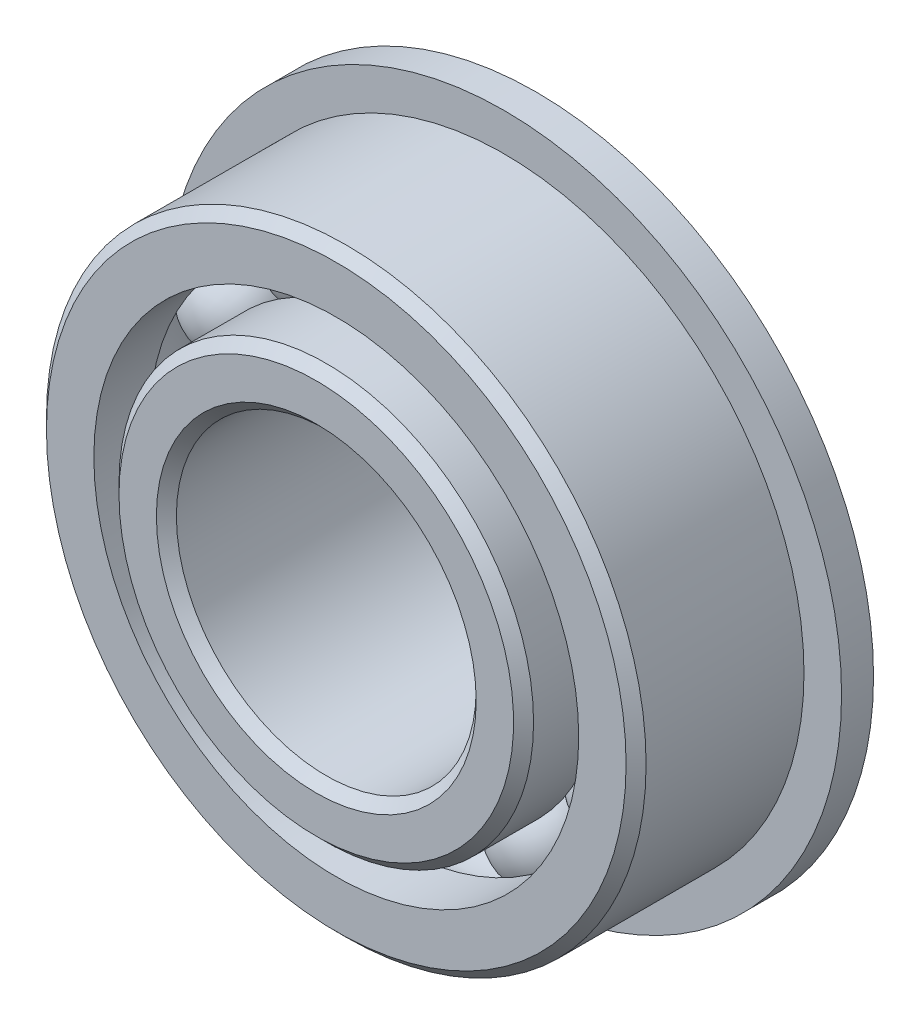
ISO-10303-21;
HEADER;
FILE_DESCRIPTION(('STEP AP214'),'2;1');
FILE_NAME('part.step','',(''),(''),'','','');
FILE_SCHEMA(('AUTOMOTIVE_DESIGN { 1 0 10303 214 1 1 1 1 }'));
ENDSEC;
DATA;
#1=APPLICATION_CONTEXT('core data for automotive mechanical design processes');
#2=APPLICATION_PROTOCOL_DEFINITION('international standard','automotive_design',2000,#1);
#3=PRODUCT_CONTEXT('',#1,'mechanical');
#4=PRODUCT('Part','Part','',(#3));
#5=PRODUCT_RELATED_PRODUCT_CATEGORY('part','',(#4));
#6=PRODUCT_DEFINITION_FORMATION('','',#4);
#7=PRODUCT_DEFINITION_CONTEXT('part definition',#1,'design');
#8=PRODUCT_DEFINITION('design','',#6,#7);
#9=PRODUCT_DEFINITION_SHAPE('','',#8);
#10=(LENGTH_UNIT() NAMED_UNIT(*) SI_UNIT(.MILLI.,.METRE.));
#11=(NAMED_UNIT(*) PLANE_ANGLE_UNIT() SI_UNIT($,.RADIAN.));
#12=(NAMED_UNIT(*) SI_UNIT($,.STERADIAN.) SOLID_ANGLE_UNIT());
#13=UNCERTAINTY_MEASURE_WITH_UNIT(LENGTH_MEASURE(1.E-05),#10,'distance_accuracy_value','');
#14=(GEOMETRIC_REPRESENTATION_CONTEXT(3) GLOBAL_UNCERTAINTY_ASSIGNED_CONTEXT((#13)) GLOBAL_UNIT_ASSIGNED_CONTEXT((#10,
#11,#12)) REPRESENTATION_CONTEXT('',''));
#15=CARTESIAN_POINT('',(0.,0.,0.));
#16=DIRECTION('',(0.,0.,1.));
#17=DIRECTION('',(1.,0.,0.));
#18=AXIS2_PLACEMENT_3D('',#15,#16,#17);
#19=CARTESIAN_POINT('',(0.,-3.571875,0.));
#20=DIRECTION('',(0.,-1.,0.));
#21=DIRECTION('',(0.,0.,-1.));
#22=AXIS2_PLACEMENT_3D('',#19,#20,#21);
#23=SPHERICAL_SURFACE('',#22,0.758760243513404);
#24=CARTESIAN_POINT('',(0.,-2.8131147564866,0.));
#25=VERTEX_POINT('',#24);
#26=VERTEX_LOOP('',#25);
#27=FACE_BOUND('',#26,.T.);
#28=CARTESIAN_POINT('',(0.,-4.33063524351341,0.));
#29=VERTEX_POINT('',#28);
#30=VERTEX_LOOP('',#29);
#31=FACE_BOUND('',#30,.T.);
#32=ADVANCED_FACE('P0_F15',(#27,#31),#23,.T.);
#33=CLOSED_SHELL('',(#32));
#34=MANIFOLD_SOLID_BREP('P0_B1',#33);
#35=CARTESIAN_POINT('',(0.,0.,0.));
#36=DIRECTION('',(0.,0.,1.));
#37=DIRECTION('',(1.,0.,0.));
#38=AXIS2_PLACEMENT_3D('',#35,#36,#37);
#39=TOROIDAL_SURFACE('',#38,3.57187499999999,0.758760243513403);
#40=CARTESIAN_POINT('',(0.,0.,0.705555555555555));
#41=DIRECTION('',(0.,0.,1.));
#42=DIRECTION('',(1.,0.,0.));
#43=AXIS2_PLACEMENT_3D('',#40,#41,#42);
#44=CIRCLE('',#43,3.29275412087912);
#45=CARTESIAN_POINT('',(3.29275412087912,0.,0.705555555555555));
#46=VERTEX_POINT('',#45);
#47=EDGE_CURVE('P1_E45',#46,#46,#44,.T.);
#48=ORIENTED_EDGE('',*,*,#47,.F.);
#49=EDGE_LOOP('',(#48));
#50=FACE_BOUND('',#49,.T.);
#51=CARTESIAN_POINT('',(0.,0.,-0.705555555555556));
#52=DIRECTION('',(0.,0.,1.));
#53=DIRECTION('',(1.,0.,0.));
#54=AXIS2_PLACEMENT_3D('',#51,#52,#53);
#55=CIRCLE('',#54,3.29275412087912);
#56=CARTESIAN_POINT('',(3.29275412087912,0.,-0.705555555555556));
#57=VERTEX_POINT('',#56);
#58=EDGE_CURVE('P1_E42',#57,#57,#55,.F.);
#59=ORIENTED_EDGE('',*,*,#58,.F.);
#60=EDGE_LOOP('',(#59));
#61=FACE_BOUND('',#60,.T.);
#62=ADVANCED_FACE('P1_F14',(#50,#61),#39,.F.);
#63=CARTESIAN_POINT('',(0.,0.,1.5875));
#64=DIRECTION('',(0.,0.,1.));
#65=DIRECTION('',(1.,0.,0.));
#66=AXIS2_PLACEMENT_3D('',#63,#64,#65);
#67=CYLINDRICAL_SURFACE('',#66,3.29275412087912);
#68=ORIENTED_EDGE('',*,*,#47,.T.);
#69=EDGE_LOOP('',(#68));
#70=FACE_BOUND('',#69,.T.);
#71=CARTESIAN_POINT('',(0.,0.,1.74624999993966));
#72=DIRECTION('',(0.,0.,-1.));
#73=DIRECTION('',(-1.,0.,0.));
#74=AXIS2_PLACEMENT_3D('',#71,#72,#73);
#75=CIRCLE('',#74,3.29275412087782);
#76=CARTESIAN_POINT('',(-3.29275412087782,0.,1.74624999993966));
#77=VERTEX_POINT('',#76);
#78=EDGE_CURVE('P1_E38',#77,#77,#75,.F.);
#79=ORIENTED_EDGE('',*,*,#78,.F.);
#80=EDGE_LOOP('',(#79));
#81=FACE_BOUND('',#80,.T.);
#82=ADVANCED_FACE('P1_F79',(#70,#81),#67,.T.);
#83=CARTESIAN_POINT('',(0.,0.,1.5875));
#84=DIRECTION('',(0.,0.,1.));
#85=DIRECTION('',(1.,0.,0.));
#86=AXIS2_PLACEMENT_3D('',#83,#84,#85);
#87=CYLINDRICAL_SURFACE('',#86,3.29275412087912);
#88=ORIENTED_EDGE('',*,*,#58,.T.);
#89=EDGE_LOOP('',(#88));
#90=FACE_BOUND('',#89,.T.);
#91=CARTESIAN_POINT('',(0.,0.,-1.74624999999651));
#92=DIRECTION('',(0.,0.,1.));
#93=DIRECTION('',(1.,0.,0.));
#94=AXIS2_PLACEMENT_3D('',#91,#92,#93);
#95=CIRCLE('',#94,3.29275412082097);
#96=CARTESIAN_POINT('',(3.29275412082097,0.,-1.74624999999651));
#97=VERTEX_POINT('',#96);
#98=EDGE_CURVE('P1_E34',#97,#97,#95,.F.);
#99=ORIENTED_EDGE('',*,*,#98,.F.);
#100=EDGE_LOOP('',(#99));
#101=FACE_BOUND('',#100,.T.);
#102=ADVANCED_FACE('P1_F75',(#90,#101),#87,.T.);
#103=CARTESIAN_POINT('',(0.,0.,1.74624999993966));
#104=DIRECTION('',(0.,0.,-1.));
#105=DIRECTION('',(-1.,0.,0.));
#106=AXIS2_PLACEMENT_3D('',#103,#104,#105);
#107=CONICAL_SURFACE('',#106,3.29275412087782,0.785398163397448);
#108=CARTESIAN_POINT('',(0.,0.,1.90500000002203));
#109=DIRECTION('',(0.,0.,-1.));
#110=DIRECTION('',(-1.,0.,0.));
#111=AXIS2_PLACEMENT_3D('',#108,#109,#110);
#112=CIRCLE('',#111,3.13400412079545);
#113=CARTESIAN_POINT('',(-3.13400412079545,0.,1.90500000002203));
#114=VERTEX_POINT('',#113);
#115=EDGE_CURVE('P1_E18',#114,#114,#112,.F.);
#116=ORIENTED_EDGE('',*,*,#115,.F.);
#117=EDGE_LOOP('',(#116));
#118=FACE_BOUND('',#117,.T.);
#119=ORIENTED_EDGE('',*,*,#78,.T.);
#120=EDGE_LOOP('',(#119));
#121=FACE_BOUND('',#120,.T.);
#122=ADVANCED_FACE('P1_F71',(#118,#121),#107,.T.);
#123=CARTESIAN_POINT('',(0.,0.,-1.74625000011019));
#124=DIRECTION('',(0.,0.,1.));
#125=DIRECTION('',(1.,0.,0.));
#126=AXIS2_PLACEMENT_3D('',#123,#124,#125);
#127=CONICAL_SURFACE('',#126,3.29275412076413,0.785398163397448);
#128=ORIENTED_EDGE('',*,*,#98,.T.);
#129=EDGE_LOOP('',(#128));
#130=FACE_BOUND('',#129,.T.);
#131=CARTESIAN_POINT('',(0.,0.,-1.90500000002203));
#132=DIRECTION('',(0.,0.,1.));
#133=DIRECTION('',(1.,0.,0.));
#134=AXIS2_PLACEMENT_3D('',#131,#132,#133);
#135=CIRCLE('',#134,3.1340041208523);
#136=CARTESIAN_POINT('',(3.1340041208523,0.,-1.90500000002203));
#137=VERTEX_POINT('',#136);
#138=EDGE_CURVE('P1_E56',#137,#137,#135,.F.);
#139=ORIENTED_EDGE('',*,*,#138,.F.);
#140=EDGE_LOOP('',(#139));
#141=FACE_BOUND('',#140,.T.);
#142=ADVANCED_FACE('P1_F74',(#130,#141),#127,.T.);
#143=CARTESIAN_POINT('',(0.,2.54,1.905));
#144=DIRECTION('',(0.,0.,1.));
#145=DIRECTION('',(1.,0.,0.));
#146=AXIS2_PLACEMENT_3D('',#143,#144,#145);
#147=PLANE('',#146);
#148=ORIENTED_EDGE('',*,*,#115,.T.);
#149=EDGE_LOOP('',(#148));
#150=FACE_BOUND('',#149,.T.);
#151=CARTESIAN_POINT('',(0.,0.,1.90500000002203));
#152=DIRECTION('',(0.,0.,1.));
#153=DIRECTION('',(1.,0.,0.));
#154=AXIS2_PLACEMENT_3D('',#151,#152,#153);
#155=CIRCLE('',#154,2.53999999995358);
#156=CARTESIAN_POINT('',(2.53999999995358,0.,1.90500000002203));
#157=VERTEX_POINT('',#156);
#158=EDGE_CURVE('P1_E54',#157,#157,#155,.F.);
#159=ORIENTED_EDGE('',*,*,#158,.T.);
#160=EDGE_LOOP('',(#159));
#161=FACE_BOUND('',#160,.T.);
#162=ADVANCED_FACE('P1_F68',(#150,#161),#147,.T.);
#163=CARTESIAN_POINT('',(0.,2.54,-1.905));
#164=DIRECTION('',(0.,0.,-1.));
#165=DIRECTION('',(-1.,0.,0.));
#166=AXIS2_PLACEMENT_3D('',#163,#164,#165);
#167=PLANE('',#166);
#168=CARTESIAN_POINT('',(0.,0.,-1.90500000002203));
#169=DIRECTION('',(0.,0.,-1.));
#170=DIRECTION('',(0.,1.,0.));
#171=AXIS2_PLACEMENT_3D('',#168,#169,#170);
#172=CIRCLE('',#171,2.53999999995358);
#173=CARTESIAN_POINT('',(0.,2.53999999995358,-1.90500000002203));
#174=VERTEX_POINT('',#173);
#175=EDGE_CURVE('P1_E31',#174,#174,#172,.F.);
#176=ORIENTED_EDGE('',*,*,#175,.T.);
#177=EDGE_LOOP('',(#176));
#178=FACE_BOUND('',#177,.T.);
#179=ORIENTED_EDGE('',*,*,#138,.T.);
#180=EDGE_LOOP('',(#179));
#181=FACE_BOUND('',#180,.T.);
#182=ADVANCED_FACE('P1_F103',(#178,#181),#167,.T.);
#183=CARTESIAN_POINT('',(0.,0.,1.90499999990834));
#184=DIRECTION('',(0.,0.,1.));
#185=DIRECTION('',(1.,0.,0.));
#186=AXIS2_PLACEMENT_3D('',#183,#184,#185);
#187=CONICAL_SURFACE('',#186,2.53999999983989,0.785398163397448);
#188=ORIENTED_EDGE('',*,*,#158,.F.);
#189=EDGE_LOOP('',(#188));
#190=FACE_BOUND('',#189,.T.);
#191=CARTESIAN_POINT('',(0.,0.,1.74625));
#192=DIRECTION('',(0.,0.,1.));
#193=DIRECTION('',(1.,0.,0.));
#194=AXIS2_PLACEMENT_3D('',#191,#192,#193);
#195=CIRCLE('',#194,2.38125);
#196=CARTESIAN_POINT('',(2.38125,0.,1.74625));
#197=VERTEX_POINT('',#196);
#198=EDGE_CURVE('P1_E23',#197,#197,#195,.F.);
#199=ORIENTED_EDGE('',*,*,#198,.T.);
#200=EDGE_LOOP('',(#199));
#201=FACE_BOUND('',#200,.T.);
#202=ADVANCED_FACE('P1_F96',(#190,#201),#187,.F.);
#203=CARTESIAN_POINT('',(0.,0.,-1.90500000002203));
#204=DIRECTION('',(0.,0.,-1.));
#205=DIRECTION('',(0.,1.,0.));
#206=AXIS2_PLACEMENT_3D('',#203,#204,#205);
#207=CONICAL_SURFACE('',#206,2.53999999995358,0.785398163397448);
#208=CARTESIAN_POINT('',(0.,0.,-1.74625));
#209=DIRECTION('',(0.,0.,1.));
#210=DIRECTION('',(1.,0.,0.));
#211=AXIS2_PLACEMENT_3D('',#208,#209,#210);
#212=CIRCLE('',#211,2.38125);
#213=CARTESIAN_POINT('',(2.38125,0.,-1.74625));
#214=VERTEX_POINT('',#213);
#215=EDGE_CURVE('P1_E10',#214,#214,#212,.T.);
#216=ORIENTED_EDGE('',*,*,#215,.T.);
#217=EDGE_LOOP('',(#216));
#218=FACE_BOUND('',#217,.T.);
#219=ORIENTED_EDGE('',*,*,#175,.F.);
#220=EDGE_LOOP('',(#219));
#221=FACE_BOUND('',#220,.T.);
#222=ADVANCED_FACE('P1_F91',(#218,#221),#207,.F.);
#223=CARTESIAN_POINT('',(0.,0.,1.5875));
#224=DIRECTION('',(0.,0.,1.));
#225=DIRECTION('',(1.,0.,0.));
#226=AXIS2_PLACEMENT_3D('',#223,#224,#225);
#227=CYLINDRICAL_SURFACE('',#226,2.38125);
#228=ORIENTED_EDGE('',*,*,#198,.F.);
#229=EDGE_LOOP('',(#228));
#230=FACE_BOUND('',#229,.T.);
#231=ORIENTED_EDGE('',*,*,#215,.F.);
#232=EDGE_LOOP('',(#231));
#233=FACE_BOUND('',#232,.T.);
#234=ADVANCED_FACE('P1_F90',(#230,#233),#227,.F.);
#235=CLOSED_SHELL('',(#62,#82,#102,#122,#142,#162,#182,#202,#222,#234));
#236=MANIFOLD_SOLID_BREP('P1_B1',#235);
#237=CARTESIAN_POINT('',(1.78593749999998,-3.09333448914255,0.));
#238=DIRECTION('',(0.499999999999995,-0.866025403784442,0.));
#239=DIRECTION('',(0.,0.,-1.));
#240=AXIS2_PLACEMENT_3D('',#237,#238,#239);
#241=SPHERICAL_SURFACE('',#240,0.758760243513404);
#242=CARTESIAN_POINT('',(1.40655737824328,-2.43622884287828,0.));
#243=VERTEX_POINT('',#242);
#244=VERTEX_LOOP('',#243);
#245=FACE_BOUND('',#244,.T.);
#246=CARTESIAN_POINT('',(2.16531762175668,-3.75044013540683,0.));
#247=VERTEX_POINT('',#246);
#248=VERTEX_LOOP('',#247);
#249=FACE_BOUND('',#248,.T.);
#250=ADVANCED_FACE('P2_F15',(#245,#249),#241,.T.);
#251=CLOSED_SHELL('',(#250));
#252=MANIFOLD_SOLID_BREP('P2_B1',#251);
#253=CARTESIAN_POINT('',(1.7859375,3.09333448914254,0.));
#254=DIRECTION('',(0.500000000000001,0.866025403784438,0.));
#255=DIRECTION('',(0.,0.,-1.));
#256=AXIS2_PLACEMENT_3D('',#253,#254,#255);
#257=SPHERICAL_SURFACE('',#256,0.758760243513404);
#258=CARTESIAN_POINT('',(1.4065573782433,2.43622884287827,0.));
#259=VERTEX_POINT('',#258);
#260=VERTEX_LOOP('',#259);
#261=FACE_BOUND('',#260,.T.);
#262=CARTESIAN_POINT('',(2.16531762175671,3.75044013540681,0.));
#263=VERTEX_POINT('',#262);
#264=VERTEX_LOOP('',#263);
#265=FACE_BOUND('',#264,.T.);
#266=ADVANCED_FACE('P3_F15',(#261,#265),#257,.T.);
#267=CLOSED_SHELL('',(#266));
#268=MANIFOLD_SOLID_BREP('P3_B1',#267);
#269=CARTESIAN_POINT('',(3.09333448914253,-1.78593750000002,0.));
#270=DIRECTION('',(0.866025403784436,-0.500000000000004,0.));
#271=DIRECTION('',(0.,0.,-1.));
#272=AXIS2_PLACEMENT_3D('',#269,#270,#271);
#273=SPHERICAL_SURFACE('',#272,0.758760243513404);
#274=CARTESIAN_POINT('',(2.43622884287826,-1.40655737824331,0.));
#275=VERTEX_POINT('',#274);
#276=VERTEX_LOOP('',#275);
#277=FACE_BOUND('',#276,.T.);
#278=CARTESIAN_POINT('',(3.75044013540681,-2.16531762175672,0.));
#279=VERTEX_POINT('',#278);
#280=VERTEX_LOOP('',#279);
#281=FACE_BOUND('',#280,.T.);
#282=ADVANCED_FACE('P4_F15',(#277,#281),#273,.T.);
#283=CLOSED_SHELL('',(#282));
#284=MANIFOLD_SOLID_BREP('P4_B1',#283);
#285=CARTESIAN_POINT('',(3.571875,0.,0.));
#286=DIRECTION('',(1.,0.,0.));
#287=DIRECTION('',(0.,0.,-1.));
#288=AXIS2_PLACEMENT_3D('',#285,#286,#287);
#289=SPHERICAL_SURFACE('',#288,0.758760243513404);
#290=CARTESIAN_POINT('',(4.33063524351341,0.,0.));
#291=VERTEX_POINT('',#290);
#292=VERTEX_LOOP('',#291);
#293=FACE_BOUND('',#292,.T.);
#294=CARTESIAN_POINT('',(2.8131147564866,0.,0.));
#295=VERTEX_POINT('',#294);
#296=VERTEX_LOOP('',#295);
#297=FACE_BOUND('',#296,.T.);
#298=ADVANCED_FACE('P5_F15',(#293,#297),#289,.T.);
#299=CLOSED_SHELL('',(#298));
#300=MANIFOLD_SOLID_BREP('P5_B1',#299);
#301=CARTESIAN_POINT('',(0.,3.571875,0.));
#302=DIRECTION('',(0.,1.,0.));
#303=DIRECTION('',(0.,0.,-1.));
#304=AXIS2_PLACEMENT_3D('',#301,#302,#303);
#305=SPHERICAL_SURFACE('',#304,0.758760243513404);
#306=CARTESIAN_POINT('',(0.,2.8131147564866,0.));
#307=VERTEX_POINT('',#306);
#308=VERTEX_LOOP('',#307);
#309=FACE_BOUND('',#308,.T.);
#310=CARTESIAN_POINT('',(0.,4.33063524351341,0.));
#311=VERTEX_POINT('',#310);
#312=VERTEX_LOOP('',#311);
#313=FACE_BOUND('',#312,.T.);
#314=ADVANCED_FACE('P6_F15',(#309,#313),#305,.T.);
#315=CLOSED_SHELL('',(#314));
#316=MANIFOLD_SOLID_BREP('P6_B1',#315);
#317=CARTESIAN_POINT('',(3.09333448914255,1.78593749999999,0.));
#318=DIRECTION('',(0.86602540378444,0.499999999999998,0.));
#319=DIRECTION('',(0.,0.,-1.));
#320=AXIS2_PLACEMENT_3D('',#317,#318,#319);
#321=SPHERICAL_SURFACE('',#320,0.758760243513404);
#322=CARTESIAN_POINT('',(3.75044013540682,2.16531762175669,0.));
#323=VERTEX_POINT('',#322);
#324=VERTEX_LOOP('',#323);
#325=FACE_BOUND('',#324,.T.);
#326=CARTESIAN_POINT('',(2.43622884287827,1.40655737824329,0.));
#327=VERTEX_POINT('',#326);
#328=VERTEX_LOOP('',#327);
#329=FACE_BOUND('',#328,.T.);
#330=ADVANCED_FACE('P7_F15',(#325,#329),#321,.T.);
#331=CLOSED_SHELL('',(#330));
#332=MANIFOLD_SOLID_BREP('P7_B1',#331);
#333=CARTESIAN_POINT('',(-3.571875,0.,0.));
#334=DIRECTION('',(-1.,0.,0.));
#335=DIRECTION('',(0.,0.,-1.));
#336=AXIS2_PLACEMENT_3D('',#333,#334,#335);
#337=SPHERICAL_SURFACE('',#336,0.758760243513404);
#338=CARTESIAN_POINT('',(-4.33063524351341,0.,0.));
#339=VERTEX_POINT('',#338);
#340=VERTEX_LOOP('',#339);
#341=FACE_BOUND('',#340,.T.);
#342=CARTESIAN_POINT('',(-2.8131147564866,0.,0.));
#343=VERTEX_POINT('',#342);
#344=VERTEX_LOOP('',#343);
#345=FACE_BOUND('',#344,.T.);
#346=ADVANCED_FACE('P8_F15',(#341,#345),#337,.T.);
#347=CLOSED_SHELL('',(#346));
#348=MANIFOLD_SOLID_BREP('P8_B1',#347);
#349=CARTESIAN_POINT('',(-3.09333448914256,-1.78593749999997,0.));
#350=DIRECTION('',(-0.866025403784443,-0.499999999999992,0.));
#351=DIRECTION('',(0.,0.,-1.));
#352=AXIS2_PLACEMENT_3D('',#349,#350,#351);
#353=SPHERICAL_SURFACE('',#352,0.758760243513404);
#354=CARTESIAN_POINT('',(-3.75044013540684,-2.16531762175667,0.));
#355=VERTEX_POINT('',#354);
#356=VERTEX_LOOP('',#355);
#357=FACE_BOUND('',#356,.T.);
#358=CARTESIAN_POINT('',(-2.43622884287828,-1.40655737824328,0.));
#359=VERTEX_POINT('',#358);
#360=VERTEX_LOOP('',#359);
#361=FACE_BOUND('',#360,.T.);
#362=ADVANCED_FACE('P9_F15',(#357,#361),#353,.T.);
#363=CLOSED_SHELL('',(#362));
#364=MANIFOLD_SOLID_BREP('P9_B1',#363);
#365=CARTESIAN_POINT('',(-3.09333448914252,1.78593750000004,0.));
#366=DIRECTION('',(-0.866025403784433,0.50000000000001,0.));
#367=DIRECTION('',(0.,0.,-1.));
#368=AXIS2_PLACEMENT_3D('',#365,#366,#367);
#369=SPHERICAL_SURFACE('',#368,0.758760243513404);
#370=CARTESIAN_POINT('',(-2.43622884287825,1.40655737824333,0.));
#371=VERTEX_POINT('',#370);
#372=VERTEX_LOOP('',#371);
#373=FACE_BOUND('',#372,.T.);
#374=CARTESIAN_POINT('',(-3.75044013540679,2.16531762175675,0.));
#375=VERTEX_POINT('',#374);
#376=VERTEX_LOOP('',#375);
#377=FACE_BOUND('',#376,.T.);
#378=ADVANCED_FACE('P10_F15',(#373,#377),#369,.T.);
#379=CLOSED_SHELL('',(#378));
#380=MANIFOLD_SOLID_BREP('P10_B1',#379);
#381=CARTESIAN_POINT('',(-1.78593749999996,3.09333448914257,0.));
#382=DIRECTION('',(-0.499999999999989,0.866025403784445,0.));
#383=DIRECTION('',(0.,0.,-1.));
#384=AXIS2_PLACEMENT_3D('',#381,#382,#383);
#385=SPHERICAL_SURFACE('',#384,0.758760243513404);
#386=CARTESIAN_POINT('',(-2.16531762175665,3.75044013540685,0.));
#387=VERTEX_POINT('',#386);
#388=VERTEX_LOOP('',#387);
#389=FACE_BOUND('',#388,.T.);
#390=CARTESIAN_POINT('',(-1.40655737824327,2.43622884287829,0.));
#391=VERTEX_POINT('',#390);
#392=VERTEX_LOOP('',#391);
#393=FACE_BOUND('',#392,.T.);
#394=ADVANCED_FACE('P11_F15',(#389,#393),#385,.T.);
#395=CLOSED_SHELL('',(#394));
#396=MANIFOLD_SOLID_BREP('P11_B1',#395);
#397=CARTESIAN_POINT('',(0.,4.60375,1.5875));
#398=DIRECTION('',(0.,0.,-1.));
#399=DIRECTION('',(-1.,0.,0.));
#400=AXIS2_PLACEMENT_3D('',#397,#398,#399);
#401=PLANE('',#400);
#402=CARTESIAN_POINT('',(0.,0.,1.58750000002783));
#403=DIRECTION('',(0.,0.,-1.));
#404=DIRECTION('',(-1.,0.,0.));
#405=AXIS2_PLACEMENT_3D('',#402,#403,#404);
#406=CIRCLE('',#405,4.60374999994428);
#407=CARTESIAN_POINT('',(-4.60374999994428,0.,1.58750000002783));
#408=VERTEX_POINT('',#407);
#409=EDGE_CURVE('P12_E25',#408,#408,#406,.T.);
#410=ORIENTED_EDGE('',*,*,#409,.F.);
#411=EDGE_LOOP('',(#410));
#412=FACE_BOUND('',#411,.T.);
#413=CARTESIAN_POINT('',(0.,0.,1.5875));
#414=DIRECTION('',(0.,0.,1.));
#415=DIRECTION('',(1.,0.,0.));
#416=AXIS2_PLACEMENT_3D('',#413,#414,#415);
#417=CIRCLE('',#416,3.85099587912088);
#418=CARTESIAN_POINT('',(3.85099587912088,0.,1.5875));
#419=VERTEX_POINT('',#418);
#420=EDGE_CURVE('P12_E52',#419,#419,#417,.F.);
#421=ORIENTED_EDGE('',*,*,#420,.T.);
#422=EDGE_LOOP('',(#421));
#423=FACE_BOUND('',#422,.T.);
#424=ADVANCED_FACE('P12_F22',(#412,#423),#401,.F.);
#425=CARTESIAN_POINT('',(0.,0.,1.42874999994547));
#426=DIRECTION('',(0.,0.,-1.));
#427=DIRECTION('',(-1.,0.,0.));
#428=AXIS2_PLACEMENT_3D('',#425,#426,#427);
#429=CONICAL_SURFACE('',#428,4.76250000002665,0.785398163397448);
#430=ORIENTED_EDGE('',*,*,#409,.T.);
#431=EDGE_LOOP('',(#430));
#432=FACE_BOUND('',#431,.T.);
#433=CARTESIAN_POINT('',(0.,0.,1.42875));
#434=DIRECTION('',(0.,0.,1.));
#435=DIRECTION('',(1.,0.,0.));
#436=AXIS2_PLACEMENT_3D('',#433,#434,#435);
#437=CIRCLE('',#436,4.7625);
#438=CARTESIAN_POINT('',(4.7625,0.,1.42875));
#439=VERTEX_POINT('',#438);
#440=EDGE_CURVE('P12_E42',#439,#439,#437,.F.);
#441=ORIENTED_EDGE('',*,*,#440,.F.);
#442=EDGE_LOOP('',(#441));
#443=FACE_BOUND('',#442,.T.);
#444=ADVANCED_FACE('P12_F69',(#432,#443),#429,.T.);
#445=CARTESIAN_POINT('',(0.,0.,1.5875));
#446=DIRECTION('',(0.,0.,1.));
#447=DIRECTION('',(1.,0.,0.));
#448=AXIS2_PLACEMENT_3D('',#445,#446,#447);
#449=CYLINDRICAL_SURFACE('',#448,3.85099587912088);
#450=CARTESIAN_POINT('',(0.,0.,0.705555555555555));
#451=DIRECTION('',(0.,0.,1.));
#452=DIRECTION('',(1.,0.,0.));
#453=AXIS2_PLACEMENT_3D('',#450,#451,#452);
#454=CIRCLE('',#453,3.85099587912088);
#455=CARTESIAN_POINT('',(3.85099587912088,0.,0.705555555555555));
#456=VERTEX_POINT('',#455);
#457=EDGE_CURVE('P12_E51',#456,#456,#454,.F.);
#458=ORIENTED_EDGE('',*,*,#457,.T.);
#459=EDGE_LOOP('',(#458));
#460=FACE_BOUND('',#459,.T.);
#461=ORIENTED_EDGE('',*,*,#420,.F.);
#462=EDGE_LOOP('',(#461));
#463=FACE_BOUND('',#462,.T.);
#464=ADVANCED_FACE('P12_F77',(#460,#463),#449,.F.);
#465=CARTESIAN_POINT('',(0.,0.,1.5875));
#466=DIRECTION('',(0.,0.,1.));
#467=DIRECTION('',(1.,0.,0.));
#468=AXIS2_PLACEMENT_3D('',#465,#466,#467);
#469=CYLINDRICAL_SURFACE('',#468,4.7625);
#470=CARTESIAN_POINT('',(0.,0.,-1.0795));
#471=DIRECTION('',(0.,0.,1.));
#472=DIRECTION('',(1.,0.,0.));
#473=AXIS2_PLACEMENT_3D('',#470,#471,#472);
#474=CIRCLE('',#473,4.7625);
#475=CARTESIAN_POINT('',(4.7625,0.,-1.0795));
#476=VERTEX_POINT('',#475);
#477=EDGE_CURVE('P12_E48',#476,#476,#474,.F.);
#478=ORIENTED_EDGE('',*,*,#477,.F.);
#479=EDGE_LOOP('',(#478));
#480=FACE_BOUND('',#479,.T.);
#481=ORIENTED_EDGE('',*,*,#440,.T.);
#482=EDGE_LOOP('',(#481));
#483=FACE_BOUND('',#482,.T.);
#484=ADVANCED_FACE('P12_F99',(#480,#483),#469,.T.);
#485=CARTESIAN_POINT('',(0.,0.,0.));
#486=DIRECTION('',(0.,0.,1.));
#487=DIRECTION('',(1.,0.,0.));
#488=AXIS2_PLACEMENT_3D('',#485,#486,#487);
#489=TOROIDAL_SURFACE('',#488,3.571875,0.758760243513404);
#490=CARTESIAN_POINT('',(0.,0.,-0.705555555555556));
#491=DIRECTION('',(0.,0.,1.));
#492=DIRECTION('',(1.,0.,0.));
#493=AXIS2_PLACEMENT_3D('',#490,#491,#492);
#494=CIRCLE('',#493,3.85099587912088);
#495=CARTESIAN_POINT('',(3.85099587912088,0.,-0.705555555555556));
#496=VERTEX_POINT('',#495);
#497=EDGE_CURVE('P12_E47',#496,#496,#494,.F.);
#498=ORIENTED_EDGE('',*,*,#497,.T.);
#499=EDGE_LOOP('',(#498));
#500=FACE_BOUND('',#499,.T.);
#501=ORIENTED_EDGE('',*,*,#457,.F.);
#502=EDGE_LOOP('',(#501));
#503=FACE_BOUND('',#502,.T.);
#504=ADVANCED_FACE('P12_F94',(#500,#503),#489,.F.);
#505=CARTESIAN_POINT('',(0.,3.85099587912088,-1.0795));
#506=DIRECTION('',(0.,0.,1.));
#507=DIRECTION('',(1.,0.,0.));
#508=AXIS2_PLACEMENT_3D('',#505,#506,#507);
#509=PLANE('',#508);
#510=ORIENTED_EDGE('',*,*,#477,.T.);
#511=EDGE_LOOP('',(#510));
#512=FACE_BOUND('',#511,.T.);
#513=CARTESIAN_POINT('',(0.,0.,-1.0795));
#514=DIRECTION('',(0.,0.,-1.));
#515=DIRECTION('',(-1.,0.,0.));
#516=AXIS2_PLACEMENT_3D('',#513,#514,#515);
#517=CIRCLE('',#516,5.3594);
#518=CARTESIAN_POINT('',(-5.3594,0.,-1.0795));
#519=VERTEX_POINT('',#518);
#520=EDGE_CURVE('P12_E39',#519,#519,#517,.T.);
#521=ORIENTED_EDGE('',*,*,#520,.F.);
#522=EDGE_LOOP('',(#521));
#523=FACE_BOUND('',#522,.T.);
#524=ADVANCED_FACE('P12_F90',(#512,#523),#509,.T.);
#525=CARTESIAN_POINT('',(0.,0.,1.5875));
#526=DIRECTION('',(0.,0.,1.));
#527=DIRECTION('',(1.,0.,0.));
#528=AXIS2_PLACEMENT_3D('',#525,#526,#527);
#529=CYLINDRICAL_SURFACE('',#528,3.85099587912088);
#530=CARTESIAN_POINT('',(0.,0.,-1.5875));
#531=DIRECTION('',(0.,0.,1.));
#532=DIRECTION('',(1.,0.,0.));
#533=AXIS2_PLACEMENT_3D('',#530,#531,#532);
#534=CIRCLE('',#533,3.85099587912088);
#535=CARTESIAN_POINT('',(3.85099587912088,0.,-1.5875));
#536=VERTEX_POINT('',#535);
#537=EDGE_CURVE('P12_E30',#536,#536,#534,.F.);
#538=ORIENTED_EDGE('',*,*,#537,.T.);
#539=EDGE_LOOP('',(#538));
#540=FACE_BOUND('',#539,.T.);
#541=ORIENTED_EDGE('',*,*,#497,.F.);
#542=EDGE_LOOP('',(#541));
#543=FACE_BOUND('',#542,.T.);
#544=ADVANCED_FACE('P12_F85',(#540,#543),#529,.F.);
#545=CARTESIAN_POINT('',(0.,0.,-1.5875));
#546=DIRECTION('',(0.,0.,-1.));
#547=DIRECTION('',(-1.,0.,0.));
#548=AXIS2_PLACEMENT_3D('',#545,#546,#547);
#549=CYLINDRICAL_SURFACE('',#548,5.3594);
#550=CARTESIAN_POINT('',(0.,0.,-1.5875));
#551=DIRECTION('',(0.,0.,-1.));
#552=DIRECTION('',(-1.,0.,0.));
#553=AXIS2_PLACEMENT_3D('',#550,#551,#552);
#554=CIRCLE('',#553,5.3594);
#555=CARTESIAN_POINT('',(-5.3594,0.,-1.5875));
#556=VERTEX_POINT('',#555);
#557=EDGE_CURVE('P12_E12',#556,#556,#554,.F.);
#558=ORIENTED_EDGE('',*,*,#557,.T.);
#559=EDGE_LOOP('',(#558));
#560=FACE_BOUND('',#559,.T.);
#561=ORIENTED_EDGE('',*,*,#520,.T.);
#562=EDGE_LOOP('',(#561));
#563=FACE_BOUND('',#562,.T.);
#564=ADVANCED_FACE('P12_F80',(#560,#563),#549,.T.);
#565=CARTESIAN_POINT('',(0.,4.60375,-1.5875));
#566=DIRECTION('',(0.,0.,1.));
#567=DIRECTION('',(1.,0.,0.));
#568=AXIS2_PLACEMENT_3D('',#565,#566,#567);
#569=PLANE('',#568);
#570=ORIENTED_EDGE('',*,*,#557,.F.);
#571=EDGE_LOOP('',(#570));
#572=FACE_BOUND('',#571,.T.);
#573=ORIENTED_EDGE('',*,*,#537,.F.);
#574=EDGE_LOOP('',(#573));
#575=FACE_BOUND('',#574,.T.);
#576=ADVANCED_FACE('P12_F78',(#572,#575),#569,.F.);
#577=CLOSED_SHELL('',(#424,#444,#464,#484,#504,#524,#544,#564,#576));
#578=MANIFOLD_SOLID_BREP('P12_B1',#577);
#579=CARTESIAN_POINT('',(-1.78593750000003,-3.09333448914253,0.));
#580=DIRECTION('',(-0.500000000000007,-0.866025403784434,0.));
#581=DIRECTION('',(0.,0.,-1.));
#582=AXIS2_PLACEMENT_3D('',#579,#580,#581);
#583=SPHERICAL_SURFACE('',#582,0.758760243513404);
#584=CARTESIAN_POINT('',(-2.16531762175673,-3.7504401354068,0.));
#585=VERTEX_POINT('',#584);
#586=VERTEX_LOOP('',#585);
#587=FACE_BOUND('',#586,.T.);
#588=CARTESIAN_POINT('',(-1.40655737824332,-2.43622884287826,0.));
#589=VERTEX_POINT('',#588);
#590=VERTEX_LOOP('',#589);
#591=FACE_BOUND('',#590,.T.);
#592=ADVANCED_FACE('P13_F15',(#587,#591),#583,.T.);
#593=CLOSED_SHELL('',(#592));
#594=MANIFOLD_SOLID_BREP('P13_B1',#593);
#595=ADVANCED_BREP_SHAPE_REPRESENTATION('',(#18,#34,#236,#252,#268,#284,#300,#316,#332,#348,
#364,#380,#396,#578,#594),#14);
#596=SHAPE_DEFINITION_REPRESENTATION(#9,#595);
ENDSEC;
END-ISO-10303-21;
